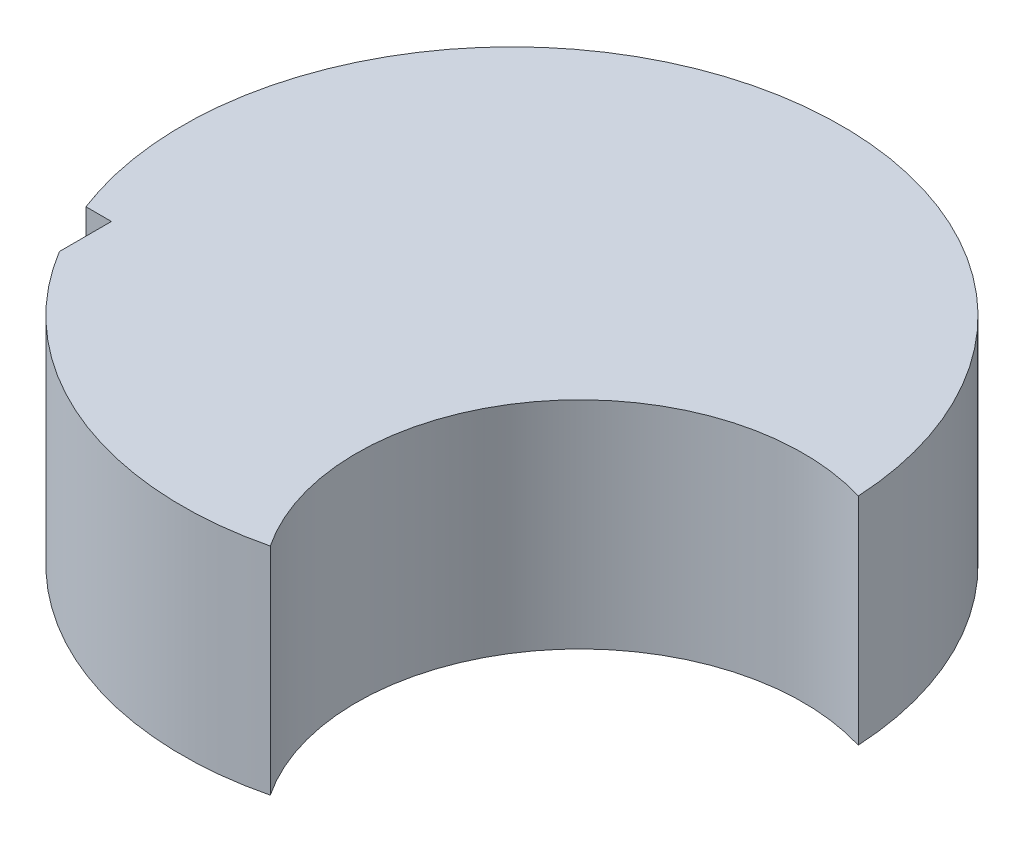
ISO-10303-21;
HEADER;
FILE_DESCRIPTION(('STEP AP214'),'2;1');
FILE_NAME('part.step','',(''),(''),'','','');
FILE_SCHEMA(('AUTOMOTIVE_DESIGN { 1 0 10303 214 1 1 1 1 }'));
ENDSEC;
DATA;
#1=APPLICATION_CONTEXT('core data for automotive mechanical design processes');
#2=APPLICATION_PROTOCOL_DEFINITION('international standard','automotive_design',2000,#1);
#3=PRODUCT_CONTEXT('',#1,'mechanical');
#4=PRODUCT('Part','Part','',(#3));
#5=PRODUCT_RELATED_PRODUCT_CATEGORY('part','',(#4));
#6=PRODUCT_DEFINITION_FORMATION('','',#4);
#7=PRODUCT_DEFINITION_CONTEXT('part definition',#1,'design');
#8=PRODUCT_DEFINITION('design','',#6,#7);
#9=PRODUCT_DEFINITION_SHAPE('','',#8);
#10=(LENGTH_UNIT() NAMED_UNIT(*) SI_UNIT(.MILLI.,.METRE.));
#11=(NAMED_UNIT(*) PLANE_ANGLE_UNIT() SI_UNIT($,.RADIAN.));
#12=(NAMED_UNIT(*) SI_UNIT($,.STERADIAN.) SOLID_ANGLE_UNIT());
#13=UNCERTAINTY_MEASURE_WITH_UNIT(LENGTH_MEASURE(1.E-05),#10,'distance_accuracy_value','');
#14=(GEOMETRIC_REPRESENTATION_CONTEXT(3) GLOBAL_UNCERTAINTY_ASSIGNED_CONTEXT((#13)) GLOBAL_UNIT_ASSIGNED_CONTEXT((#10,
#11,#12)) REPRESENTATION_CONTEXT('',''));
#15=CARTESIAN_POINT('',(0.,0.,0.));
#16=DIRECTION('',(0.,0.,1.));
#17=DIRECTION('',(1.,0.,0.));
#18=AXIS2_PLACEMENT_3D('',#15,#16,#17);
#19=CARTESIAN_POINT('',(0.,60.96,0.));
#20=DIRECTION('',(0.,-1.,0.));
#21=DIRECTION('',(0.,0.,-1.));
#22=AXIS2_PLACEMENT_3D('',#19,#20,#21);
#23=CYLINDRICAL_SURFACE('',#22,93.1030963181767);
#24=CARTESIAN_POINT('',(0.,0.,0.));
#25=DIRECTION('',(0.,1.,0.));
#26=DIRECTION('',(0.,0.,1.));
#27=AXIS2_PLACEMENT_3D('',#24,#25,#26);
#28=CIRCLE('',#27,93.1030963181767);
#29=CARTESIAN_POINT('',(92.9761172240868,0.,-4.86088160363501));
#30=VERTEX_POINT('',#29);
#31=CARTESIAN_POINT('',(-86.8821417475048,0.,33.4616196469652));
#32=VERTEX_POINT('',#31);
#33=EDGE_CURVE('E81',#30,#32,#28,.T.);
#34=ORIENTED_EDGE('',*,*,#33,.T.);
#35=DIRECTION('',(0.,-1.,0.));
#36=VECTOR('',#35,1.);
#37=CARTESIAN_POINT('',(-86.8821417475048,60.96,33.4616196469652));
#38=LINE('',#37,#36);
#39=CARTESIAN_POINT('',(-86.8821417475048,60.96,33.4616196469652));
#40=VERTEX_POINT('',#39);
#41=EDGE_CURVE('E110',#40,#32,#38,.T.);
#42=ORIENTED_EDGE('',*,*,#41,.F.);
#43=CARTESIAN_POINT('',(0.,60.96,0.));
#44=DIRECTION('',(0.,1.,0.));
#45=DIRECTION('',(0.,0.,1.));
#46=AXIS2_PLACEMENT_3D('',#43,#44,#45);
#47=CIRCLE('',#46,93.1030963181767);
#48=CARTESIAN_POINT('',(92.9761172240868,60.96,-4.86088160363501));
#49=VERTEX_POINT('',#48);
#50=EDGE_CURVE('E88',#49,#40,#47,.T.);
#51=ORIENTED_EDGE('',*,*,#50,.F.);
#52=DIRECTION('',(0.,-1.,0.));
#53=VECTOR('',#52,1.);
#54=CARTESIAN_POINT('',(92.9761172240868,60.96,-4.86088160363501));
#55=LINE('',#54,#53);
#56=EDGE_CURVE('E11',#49,#30,#55,.T.);
#57=ORIENTED_EDGE('',*,*,#56,.T.);
#58=EDGE_LOOP('',(#34,#42,#51,#57));
#59=FACE_BOUND('',#58,.T.);
#60=ADVANCED_FACE('F33',(#59),#23,.T.);
#61=CARTESIAN_POINT('',(74.7241246344848,60.96,55.5382007418468));
#62=DIRECTION('',(0.,-1.,0.));
#63=DIRECTION('',(0.,0.,-1.));
#64=AXIS2_PLACEMENT_3D('',#61,#62,#63);
#65=CYLINDRICAL_SURFACE('',#64,63.0966273398759);
#66=CARTESIAN_POINT('',(74.7241246344848,0.,55.5382007418468));
#67=DIRECTION('',(0.,-1.,0.));
#68=DIRECTION('',(0.,0.,1.));
#69=AXIS2_PLACEMENT_3D('',#66,#67,#68);
#70=CIRCLE('',#69,63.0966273398759);
#71=CARTESIAN_POINT('',(22.1523217342251,0.,90.4293159645425));
#72=VERTEX_POINT('',#71);
#73=EDGE_CURVE('E82',#72,#30,#70,.T.);
#74=ORIENTED_EDGE('',*,*,#73,.T.);
#75=ORIENTED_EDGE('',*,*,#56,.F.);
#76=CARTESIAN_POINT('',(74.7241246344848,60.96,55.5382007418468));
#77=DIRECTION('',(0.,-1.,0.));
#78=DIRECTION('',(0.,0.,1.));
#79=AXIS2_PLACEMENT_3D('',#76,#77,#78);
#80=CIRCLE('',#79,63.0966273398759);
#81=CARTESIAN_POINT('',(22.1523217342251,60.96,90.4293159645425));
#82=VERTEX_POINT('',#81);
#83=EDGE_CURVE('E87',#82,#49,#80,.T.);
#84=ORIENTED_EDGE('',*,*,#83,.F.);
#85=DIRECTION('',(0.,-1.,0.));
#86=VECTOR('',#85,1.);
#87=CARTESIAN_POINT('',(22.1523217342251,60.96,90.4293159645425));
#88=LINE('',#87,#86);
#89=EDGE_CURVE('E41',#82,#72,#88,.T.);
#90=ORIENTED_EDGE('',*,*,#89,.T.);
#91=EDGE_LOOP('',(#74,#75,#84,#90));
#92=FACE_BOUND('',#91,.T.);
#93=ADVANCED_FACE('F35',(#92),#65,.F.);
#94=CARTESIAN_POINT('',(-79.6790673277547,60.96,48.1604897588347));
#95=VERTEX_POINT('',#94);
#96=EDGE_CURVE('E57',#95,#82,#47,.T.);
#97=ORIENTED_EDGE('',*,*,#96,.F.);
#98=DIRECTION('',(0.,-1.,0.));
#99=VECTOR('',#98,1.);
#100=CARTESIAN_POINT('',(-79.6790673277547,60.96,48.1604897588347));
#101=LINE('',#100,#99);
#102=CARTESIAN_POINT('',(-79.6790673277547,0.,48.1604897588347));
#103=VERTEX_POINT('',#102);
#104=EDGE_CURVE('E77',#103,#95,#101,.F.);
#105=ORIENTED_EDGE('',*,*,#104,.F.);
#106=EDGE_CURVE('E71',#103,#72,#28,.T.);
#107=ORIENTED_EDGE('',*,*,#106,.T.);
#108=ORIENTED_EDGE('',*,*,#89,.F.);
#109=EDGE_LOOP('',(#97,#105,#107,#108));
#110=FACE_BOUND('',#109,.T.);
#111=ADVANCED_FACE('F73',(#110),#23,.T.);
#112=CARTESIAN_POINT('',(37.3620623172424,60.96,27.7691003709234));
#113=DIRECTION('',(0.,1.,0.));
#114=DIRECTION('',(0.,0.,1.));
#115=AXIS2_PLACEMENT_3D('',#112,#113,#114);
#116=PLANE('',#115);
#117=DIRECTION('',(-1.,0.,0.));
#118=VECTOR('',#117,1.);
#119=CARTESIAN_POINT('',(-120.640705171453,60.96,33.4616196469652));
#120=LINE('',#119,#118);
#121=CARTESIAN_POINT('',(-79.6790673277547,60.96,33.4616196469652));
#122=VERTEX_POINT('',#121);
#123=EDGE_CURVE('E103',#122,#40,#120,.T.);
#124=ORIENTED_EDGE('',*,*,#123,.F.);
#125=DIRECTION('',(0.,0.,-1.));
#126=VECTOR('',#125,1.);
#127=CARTESIAN_POINT('',(-79.6790673277547,60.96,33.4616196469652));
#128=LINE('',#127,#126);
#129=EDGE_CURVE('E106',#95,#122,#128,.T.);
#130=ORIENTED_EDGE('',*,*,#129,.F.);
#131=ORIENTED_EDGE('',*,*,#96,.T.);
#132=ORIENTED_EDGE('',*,*,#83,.T.);
#133=ORIENTED_EDGE('',*,*,#50,.T.);
#134=EDGE_LOOP('',(#124,#130,#131,#132,#133));
#135=FACE_BOUND('',#134,.T.);
#136=ADVANCED_FACE('F118',(#135),#116,.T.);
#137=CARTESIAN_POINT('',(37.3620623172424,0.,27.7691003709234));
#138=DIRECTION('',(0.,1.,0.));
#139=DIRECTION('',(0.,0.,1.));
#140=AXIS2_PLACEMENT_3D('',#137,#138,#139);
#141=PLANE('',#140);
#142=DIRECTION('',(0.,0.,1.));
#143=VECTOR('',#142,1.);
#144=CARTESIAN_POINT('',(-79.6790673277547,0.,33.4616196469652));
#145=LINE('',#144,#143);
#146=CARTESIAN_POINT('',(-79.6790673277547,0.,33.4616196469652));
#147=VERTEX_POINT('',#146);
#148=EDGE_CURVE('E91',#147,#103,#145,.T.);
#149=ORIENTED_EDGE('',*,*,#148,.F.);
#150=DIRECTION('',(1.,0.,0.));
#151=VECTOR('',#150,1.);
#152=CARTESIAN_POINT('',(-120.640705171453,0.,33.4616196469652));
#153=LINE('',#152,#151);
#154=EDGE_CURVE('E48',#32,#147,#153,.T.);
#155=ORIENTED_EDGE('',*,*,#154,.F.);
#156=ORIENTED_EDGE('',*,*,#33,.F.);
#157=ORIENTED_EDGE('',*,*,#73,.F.);
#158=ORIENTED_EDGE('',*,*,#106,.F.);
#159=EDGE_LOOP('',(#149,#155,#156,#157,#158));
#160=FACE_BOUND('',#159,.T.);
#161=ADVANCED_FACE('F89',(#160),#141,.F.);
#162=CARTESIAN_POINT('',(-120.640705171453,-0.001000000000001,33.4616196469652));
#163=DIRECTION('',(0.,0.,-1.));
#164=DIRECTION('',(-1.,0.,0.));
#165=AXIS2_PLACEMENT_3D('',#162,#163,#164);
#166=PLANE('',#165);
#167=ORIENTED_EDGE('',*,*,#41,.T.);
#168=ORIENTED_EDGE('',*,*,#154,.T.);
#169=DIRECTION('',(0.,1.,0.));
#170=VECTOR('',#169,1.);
#171=CARTESIAN_POINT('',(-79.6790673277547,-0.001000000000001,33.4616196469652));
#172=LINE('',#171,#170);
#173=EDGE_CURVE('E94',#147,#122,#172,.T.);
#174=ORIENTED_EDGE('',*,*,#173,.T.);
#175=ORIENTED_EDGE('',*,*,#123,.T.);
#176=EDGE_LOOP('',(#167,#168,#174,#175));
#177=FACE_BOUND('',#176,.T.);
#178=ADVANCED_FACE('F121',(#177),#166,.F.);
#179=CARTESIAN_POINT('',(-79.6790673277547,-0.001000000000001,33.4616196469652));
#180=DIRECTION('',(1.,0.,0.));
#181=DIRECTION('',(0.,0.,-1.));
#182=AXIS2_PLACEMENT_3D('',#179,#180,#181);
#183=PLANE('',#182);
#184=ORIENTED_EDGE('',*,*,#104,.T.);
#185=ORIENTED_EDGE('',*,*,#129,.T.);
#186=ORIENTED_EDGE('',*,*,#173,.F.);
#187=ORIENTED_EDGE('',*,*,#148,.T.);
#188=EDGE_LOOP('',(#184,#185,#186,#187));
#189=FACE_BOUND('',#188,.T.);
#190=ADVANCED_FACE('F114',(#189),#183,.F.);
#191=CLOSED_SHELL('',(#60,#93,#111,#136,#161,#178,#190));
#192=MANIFOLD_SOLID_BREP('B2',#191);
#193=ADVANCED_BREP_SHAPE_REPRESENTATION('',(#18,#192),#14);
#194=SHAPE_DEFINITION_REPRESENTATION(#9,#193);
ENDSEC;
END-ISO-10303-21;
